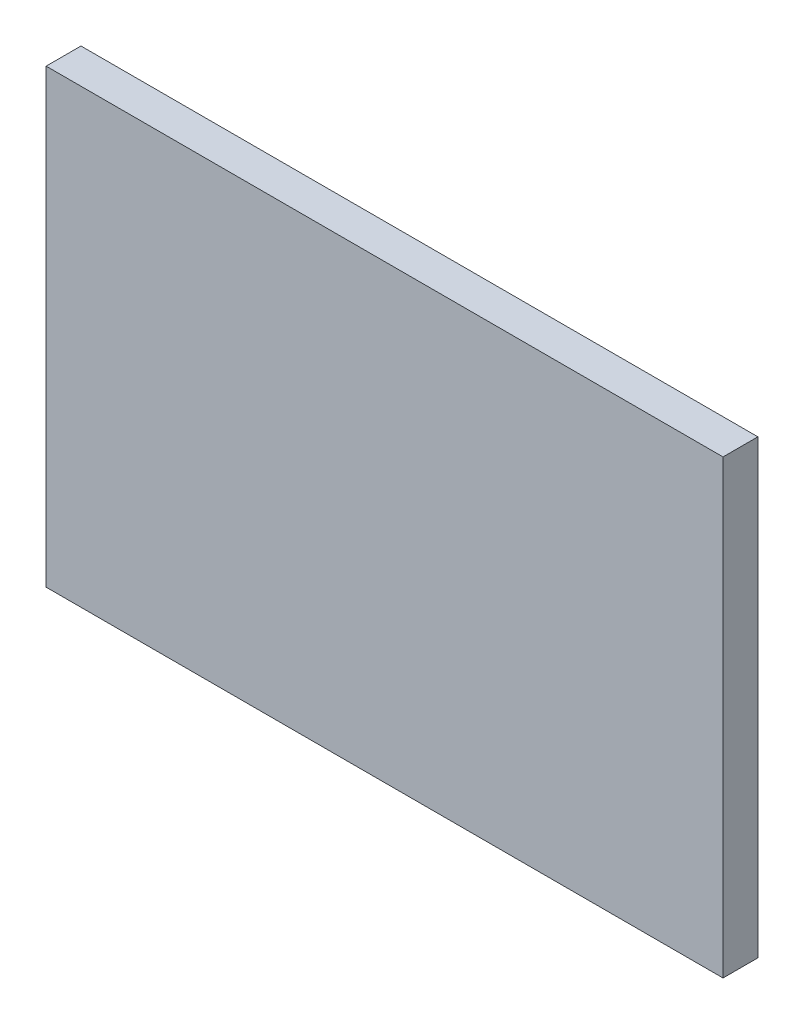
ISO-10303-21;
HEADER;
FILE_DESCRIPTION(('STEP AP214'),'2;1');
FILE_NAME('part.step','',(''),(''),'','','');
FILE_SCHEMA(('AUTOMOTIVE_DESIGN { 1 0 10303 214 1 1 1 1 }'));
ENDSEC;
DATA;
#1=APPLICATION_CONTEXT('core data for automotive mechanical design processes');
#2=APPLICATION_PROTOCOL_DEFINITION('international standard','automotive_design',2000,#1);
#3=PRODUCT_CONTEXT('',#1,'mechanical');
#4=PRODUCT('Part','Part','',(#3));
#5=PRODUCT_RELATED_PRODUCT_CATEGORY('part','',(#4));
#6=PRODUCT_DEFINITION_FORMATION('','',#4);
#7=PRODUCT_DEFINITION_CONTEXT('part definition',#1,'design');
#8=PRODUCT_DEFINITION('design','',#6,#7);
#9=PRODUCT_DEFINITION_SHAPE('','',#8);
#10=(LENGTH_UNIT() NAMED_UNIT(*) SI_UNIT(.MILLI.,.METRE.));
#11=(NAMED_UNIT(*) PLANE_ANGLE_UNIT() SI_UNIT($,.RADIAN.));
#12=(NAMED_UNIT(*) SI_UNIT($,.STERADIAN.) SOLID_ANGLE_UNIT());
#13=UNCERTAINTY_MEASURE_WITH_UNIT(LENGTH_MEASURE(1.E-05),#10,'distance_accuracy_value','');
#14=(GEOMETRIC_REPRESENTATION_CONTEXT(3) GLOBAL_UNCERTAINTY_ASSIGNED_CONTEXT((#13)) GLOBAL_UNIT_ASSIGNED_CONTEXT((#10,
#11,#12)) REPRESENTATION_CONTEXT('',''));
#15=CARTESIAN_POINT('',(0.,0.,0.));
#16=DIRECTION('',(0.,0.,1.));
#17=DIRECTION('',(1.,0.,0.));
#18=AXIS2_PLACEMENT_3D('',#15,#16,#17);
#19=CARTESIAN_POINT('',(1942.5,1295.,200.));
#20=DIRECTION('',(-1.,0.,0.));
#21=DIRECTION('',(0.,-1.,0.));
#22=AXIS2_PLACEMENT_3D('',#19,#20,#21);
#23=PLANE('',#22);
#24=DIRECTION('',(0.,1.,0.));
#25=VECTOR('',#24,1.);
#26=CARTESIAN_POINT('',(1942.5,1295.,0.));
#27=LINE('',#26,#25);
#28=CARTESIAN_POINT('',(1942.5,-1295.,0.));
#29=VERTEX_POINT('',#28);
#30=CARTESIAN_POINT('',(1942.5,1295.,0.));
#31=VERTEX_POINT('',#30);
#32=EDGE_CURVE('E98',#29,#31,#27,.T.);
#33=ORIENTED_EDGE('',*,*,#32,.T.);
#34=DIRECTION('',(0.,0.,-1.));
#35=VECTOR('',#34,1.);
#36=CARTESIAN_POINT('',(1942.5,1295.,200.));
#37=LINE('',#36,#35);
#38=CARTESIAN_POINT('',(1942.5,1295.,200.));
#39=VERTEX_POINT('',#38);
#40=EDGE_CURVE('E11',#39,#31,#37,.T.);
#41=ORIENTED_EDGE('',*,*,#40,.F.);
#42=DIRECTION('',(0.,1.,0.));
#43=VECTOR('',#42,1.);
#44=CARTESIAN_POINT('',(1942.5,1295.,200.));
#45=LINE('',#44,#43);
#46=CARTESIAN_POINT('',(1942.5,-1295.,200.));
#47=VERTEX_POINT('',#46);
#48=EDGE_CURVE('E86',#47,#39,#45,.T.);
#49=ORIENTED_EDGE('',*,*,#48,.F.);
#50=DIRECTION('',(0.,0.,-1.));
#51=VECTOR('',#50,1.);
#52=CARTESIAN_POINT('',(1942.5,-1295.,200.));
#53=LINE('',#52,#51);
#54=EDGE_CURVE('E94',#47,#29,#53,.T.);
#55=ORIENTED_EDGE('',*,*,#54,.T.);
#56=EDGE_LOOP('',(#33,#41,#49,#55));
#57=FACE_BOUND('',#56,.T.);
#58=ADVANCED_FACE('F35',(#57),#23,.F.);
#59=CARTESIAN_POINT('',(-1942.5,1295.,200.));
#60=DIRECTION('',(0.,-1.,0.));
#61=DIRECTION('',(0.,0.,-1.));
#62=AXIS2_PLACEMENT_3D('',#59,#60,#61);
#63=PLANE('',#62);
#64=DIRECTION('',(-1.,0.,0.));
#65=VECTOR('',#64,1.);
#66=CARTESIAN_POINT('',(-1942.5,1295.,0.));
#67=LINE('',#66,#65);
#68=CARTESIAN_POINT('',(-1942.5,1295.,0.));
#69=VERTEX_POINT('',#68);
#70=EDGE_CURVE('E90',#31,#69,#67,.T.);
#71=ORIENTED_EDGE('',*,*,#70,.T.);
#72=DIRECTION('',(0.,0.,-1.));
#73=VECTOR('',#72,1.);
#74=CARTESIAN_POINT('',(-1942.5,1295.,200.));
#75=LINE('',#74,#73);
#76=CARTESIAN_POINT('',(-1942.5,1295.,200.));
#77=VERTEX_POINT('',#76);
#78=EDGE_CURVE('E43',#77,#69,#75,.T.);
#79=ORIENTED_EDGE('',*,*,#78,.F.);
#80=DIRECTION('',(-1.,0.,0.));
#81=VECTOR('',#80,1.);
#82=CARTESIAN_POINT('',(-1942.5,1295.,200.));
#83=LINE('',#82,#81);
#84=EDGE_CURVE('E81',#39,#77,#83,.T.);
#85=ORIENTED_EDGE('',*,*,#84,.F.);
#86=ORIENTED_EDGE('',*,*,#40,.T.);
#87=EDGE_LOOP('',(#71,#79,#85,#86));
#88=FACE_BOUND('',#87,.T.);
#89=ADVANCED_FACE('F89',(#88),#63,.F.);
#90=CARTESIAN_POINT('',(-1942.5,1295.,200.));
#91=DIRECTION('',(1.,0.,0.));
#92=DIRECTION('',(0.,1.,0.));
#93=AXIS2_PLACEMENT_3D('',#90,#91,#92);
#94=PLANE('',#93);
#95=DIRECTION('',(0.,-1.,0.));
#96=VECTOR('',#95,1.);
#97=CARTESIAN_POINT('',(-1942.5,1295.,0.));
#98=LINE('',#97,#96);
#99=CARTESIAN_POINT('',(-1942.5,-1295.,0.));
#100=VERTEX_POINT('',#99);
#101=EDGE_CURVE('E68',#69,#100,#98,.T.);
#102=ORIENTED_EDGE('',*,*,#101,.T.);
#103=DIRECTION('',(0.,0.,-1.));
#104=VECTOR('',#103,1.);
#105=CARTESIAN_POINT('',(-1942.5,-1295.,200.));
#106=LINE('',#105,#104);
#107=CARTESIAN_POINT('',(-1942.5,-1295.,200.));
#108=VERTEX_POINT('',#107);
#109=EDGE_CURVE('E91',#108,#100,#106,.T.);
#110=ORIENTED_EDGE('',*,*,#109,.F.);
#111=DIRECTION('',(0.,-1.,0.));
#112=VECTOR('',#111,1.);
#113=CARTESIAN_POINT('',(-1942.5,1295.,200.));
#114=LINE('',#113,#112);
#115=EDGE_CURVE('E84',#77,#108,#114,.T.);
#116=ORIENTED_EDGE('',*,*,#115,.F.);
#117=ORIENTED_EDGE('',*,*,#78,.T.);
#118=EDGE_LOOP('',(#102,#110,#116,#117));
#119=FACE_BOUND('',#118,.T.);
#120=ADVANCED_FACE('F92',(#119),#94,.F.);
#121=CARTESIAN_POINT('',(-1942.5,-1295.,200.));
#122=DIRECTION('',(0.,1.,0.));
#123=DIRECTION('',(0.,0.,1.));
#124=AXIS2_PLACEMENT_3D('',#121,#122,#123);
#125=PLANE('',#124);
#126=DIRECTION('',(1.,0.,0.));
#127=VECTOR('',#126,1.);
#128=CARTESIAN_POINT('',(-1942.5,-1295.,0.));
#129=LINE('',#128,#127);
#130=EDGE_CURVE('E74',#100,#29,#129,.T.);
#131=ORIENTED_EDGE('',*,*,#130,.T.);
#132=ORIENTED_EDGE('',*,*,#54,.F.);
#133=DIRECTION('',(1.,0.,0.));
#134=VECTOR('',#133,1.);
#135=CARTESIAN_POINT('',(-1942.5,-1295.,200.));
#136=LINE('',#135,#134);
#137=EDGE_CURVE('E51',#108,#47,#136,.T.);
#138=ORIENTED_EDGE('',*,*,#137,.F.);
#139=ORIENTED_EDGE('',*,*,#109,.T.);
#140=EDGE_LOOP('',(#131,#132,#138,#139));
#141=FACE_BOUND('',#140,.T.);
#142=ADVANCED_FACE('F105',(#141),#125,.F.);
#143=CARTESIAN_POINT('',(0.,0.,200.));
#144=DIRECTION('',(0.,0.,1.));
#145=DIRECTION('',(1.,0.,0.));
#146=AXIS2_PLACEMENT_3D('',#143,#144,#145);
#147=PLANE('',#146);
#148=ORIENTED_EDGE('',*,*,#48,.T.);
#149=ORIENTED_EDGE('',*,*,#84,.T.);
#150=ORIENTED_EDGE('',*,*,#115,.T.);
#151=ORIENTED_EDGE('',*,*,#137,.T.);
#152=EDGE_LOOP('',(#148,#149,#150,#151));
#153=FACE_BOUND('',#152,.T.);
#154=ADVANCED_FACE('F82',(#153),#147,.T.);
#155=CARTESIAN_POINT('',(0.,0.,0.));
#156=DIRECTION('',(0.,0.,1.));
#157=DIRECTION('',(1.,0.,0.));
#158=AXIS2_PLACEMENT_3D('',#155,#156,#157);
#159=PLANE('',#158);
#160=ORIENTED_EDGE('',*,*,#32,.F.);
#161=ORIENTED_EDGE('',*,*,#130,.F.);
#162=ORIENTED_EDGE('',*,*,#101,.F.);
#163=ORIENTED_EDGE('',*,*,#70,.F.);
#164=EDGE_LOOP('',(#160,#161,#162,#163));
#165=FACE_BOUND('',#164,.T.);
#166=ADVANCED_FACE('F108',(#165),#159,.F.);
#167=CLOSED_SHELL('',(#58,#89,#120,#142,#154,#166));
#168=MANIFOLD_SOLID_BREP('B2',#167);
#169=ADVANCED_BREP_SHAPE_REPRESENTATION('',(#18,#168),#14);
#170=SHAPE_DEFINITION_REPRESENTATION(#9,#169);
ENDSEC;
END-ISO-10303-21;
